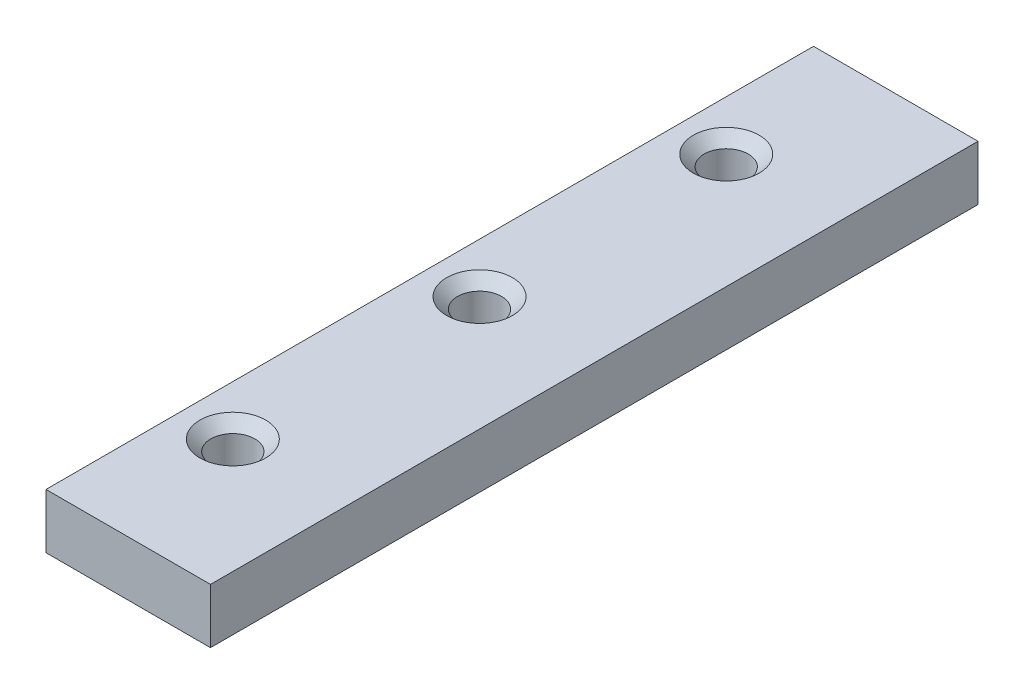
ISO-10303-21;
HEADER;
FILE_DESCRIPTION(('STEP AP214'),'2;1');
FILE_NAME('part.step','',(''),(''),'','','');
FILE_SCHEMA(('AUTOMOTIVE_DESIGN { 1 0 10303 214 1 1 1 1 }'));
ENDSEC;
DATA;
#1=APPLICATION_CONTEXT('core data for automotive mechanical design processes');
#2=APPLICATION_PROTOCOL_DEFINITION('international standard','automotive_design',2000,#1);
#3=PRODUCT_CONTEXT('',#1,'mechanical');
#4=PRODUCT('Part','Part','',(#3));
#5=PRODUCT_RELATED_PRODUCT_CATEGORY('part','',(#4));
#6=PRODUCT_DEFINITION_FORMATION('','',#4);
#7=PRODUCT_DEFINITION_CONTEXT('part definition',#1,'design');
#8=PRODUCT_DEFINITION('design','',#6,#7);
#9=PRODUCT_DEFINITION_SHAPE('','',#8);
#10=(LENGTH_UNIT() NAMED_UNIT(*) SI_UNIT(.MILLI.,.METRE.));
#11=(NAMED_UNIT(*) PLANE_ANGLE_UNIT() SI_UNIT($,.RADIAN.));
#12=(NAMED_UNIT(*) SI_UNIT($,.STERADIAN.) SOLID_ANGLE_UNIT());
#13=UNCERTAINTY_MEASURE_WITH_UNIT(LENGTH_MEASURE(1.E-05),#10,'distance_accuracy_value','');
#14=(GEOMETRIC_REPRESENTATION_CONTEXT(3) GLOBAL_UNCERTAINTY_ASSIGNED_CONTEXT((#13)) GLOBAL_UNIT_ASSIGNED_CONTEXT((#10,
#11,#12)) REPRESENTATION_CONTEXT('',''));
#15=CARTESIAN_POINT('',(0.,0.,0.));
#16=DIRECTION('',(0.,0.,1.));
#17=DIRECTION('',(1.,0.,0.));
#18=AXIS2_PLACEMENT_3D('',#15,#16,#17);
#19=CARTESIAN_POINT('',(0.,6.35,0.));
#20=DIRECTION('',(-1.,0.,0.));
#21=DIRECTION('',(0.,0.,1.));
#22=AXIS2_PLACEMENT_3D('',#19,#20,#21);
#23=PLANE('',#22);
#24=DIRECTION('',(0.,0.,-1.));
#25=VECTOR('',#24,1.);
#26=CARTESIAN_POINT('',(0.,0.,0.));
#27=LINE('',#26,#25);
#28=CARTESIAN_POINT('',(0.,0.,0.));
#29=VERTEX_POINT('',#28);
#30=CARTESIAN_POINT('',(0.,0.,-88.9));
#31=VERTEX_POINT('',#30);
#32=EDGE_CURVE('E102',#29,#31,#27,.T.);
#33=ORIENTED_EDGE('',*,*,#32,.T.);
#34=DIRECTION('',(0.,-1.,0.));
#35=VECTOR('',#34,1.);
#36=CARTESIAN_POINT('',(0.,6.35,-88.9));
#37=LINE('',#36,#35);
#38=CARTESIAN_POINT('',(0.,6.35,-88.9));
#39=VERTEX_POINT('',#38);
#40=EDGE_CURVE('E11',#39,#31,#37,.T.);
#41=ORIENTED_EDGE('',*,*,#40,.F.);
#42=DIRECTION('',(0.,0.,-1.));
#43=VECTOR('',#42,1.);
#44=CARTESIAN_POINT('',(0.,6.35,0.));
#45=LINE('',#44,#43);
#46=CARTESIAN_POINT('',(0.,6.35,0.));
#47=VERTEX_POINT('',#46);
#48=EDGE_CURVE('E90',#47,#39,#45,.T.);
#49=ORIENTED_EDGE('',*,*,#48,.F.);
#50=DIRECTION('',(0.,-1.,0.));
#51=VECTOR('',#50,1.);
#52=CARTESIAN_POINT('',(0.,6.35,0.));
#53=LINE('',#52,#51);
#54=EDGE_CURVE('E98',#47,#29,#53,.T.);
#55=ORIENTED_EDGE('',*,*,#54,.T.);
#56=EDGE_LOOP('',(#33,#41,#49,#55));
#57=FACE_BOUND('',#56,.T.);
#58=ADVANCED_FACE('F39',(#57),#23,.F.);
#59=CARTESIAN_POINT('',(0.,6.35,-88.9));
#60=DIRECTION('',(0.,0.,1.));
#61=DIRECTION('',(1.,0.,0.));
#62=AXIS2_PLACEMENT_3D('',#59,#60,#61);
#63=PLANE('',#62);
#64=DIRECTION('',(-1.,0.,0.));
#65=VECTOR('',#64,1.);
#66=CARTESIAN_POINT('',(0.,0.,-88.9));
#67=LINE('',#66,#65);
#68=CARTESIAN_POINT('',(-19.05,0.,-88.9));
#69=VERTEX_POINT('',#68);
#70=EDGE_CURVE('E94',#31,#69,#67,.T.);
#71=ORIENTED_EDGE('',*,*,#70,.T.);
#72=DIRECTION('',(0.,-1.,0.));
#73=VECTOR('',#72,1.);
#74=CARTESIAN_POINT('',(-19.05,6.35,-88.9));
#75=LINE('',#74,#73);
#76=CARTESIAN_POINT('',(-19.05,6.35,-88.9));
#77=VERTEX_POINT('',#76);
#78=EDGE_CURVE('E47',#77,#69,#75,.T.);
#79=ORIENTED_EDGE('',*,*,#78,.F.);
#80=DIRECTION('',(-1.,0.,0.));
#81=VECTOR('',#80,1.);
#82=CARTESIAN_POINT('',(0.,6.35,-88.9));
#83=LINE('',#82,#81);
#84=EDGE_CURVE('E85',#39,#77,#83,.T.);
#85=ORIENTED_EDGE('',*,*,#84,.F.);
#86=ORIENTED_EDGE('',*,*,#40,.T.);
#87=EDGE_LOOP('',(#71,#79,#85,#86));
#88=FACE_BOUND('',#87,.T.);
#89=ADVANCED_FACE('F93',(#88),#63,.F.);
#90=CARTESIAN_POINT('',(-19.05,6.35,0.));
#91=DIRECTION('',(1.,0.,0.));
#92=DIRECTION('',(0.,0.,-1.));
#93=AXIS2_PLACEMENT_3D('',#90,#91,#92);
#94=PLANE('',#93);
#95=DIRECTION('',(0.,0.,1.));
#96=VECTOR('',#95,1.);
#97=CARTESIAN_POINT('',(-19.05,0.,0.));
#98=LINE('',#97,#96);
#99=CARTESIAN_POINT('',(-19.05,0.,0.));
#100=VERTEX_POINT('',#99);
#101=EDGE_CURVE('E72',#69,#100,#98,.T.);
#102=ORIENTED_EDGE('',*,*,#101,.T.);
#103=DIRECTION('',(0.,-1.,0.));
#104=VECTOR('',#103,1.);
#105=CARTESIAN_POINT('',(-19.05,6.35,0.));
#106=LINE('',#105,#104);
#107=CARTESIAN_POINT('',(-19.05,6.35,0.));
#108=VERTEX_POINT('',#107);
#109=EDGE_CURVE('E95',#108,#100,#106,.T.);
#110=ORIENTED_EDGE('',*,*,#109,.F.);
#111=DIRECTION('',(0.,0.,1.));
#112=VECTOR('',#111,1.);
#113=CARTESIAN_POINT('',(-19.05,6.35,0.));
#114=LINE('',#113,#112);
#115=EDGE_CURVE('E88',#77,#108,#114,.T.);
#116=ORIENTED_EDGE('',*,*,#115,.F.);
#117=ORIENTED_EDGE('',*,*,#78,.T.);
#118=EDGE_LOOP('',(#102,#110,#116,#117));
#119=FACE_BOUND('',#118,.T.);
#120=ADVANCED_FACE('F96',(#119),#94,.F.);
#121=CARTESIAN_POINT('',(0.,6.35,0.));
#122=DIRECTION('',(0.,0.,-1.));
#123=DIRECTION('',(-1.,0.,0.));
#124=AXIS2_PLACEMENT_3D('',#121,#122,#123);
#125=PLANE('',#124);
#126=DIRECTION('',(1.,0.,0.));
#127=VECTOR('',#126,1.);
#128=CARTESIAN_POINT('',(0.,0.,0.));
#129=LINE('',#128,#127);
#130=EDGE_CURVE('E78',#100,#29,#129,.T.);
#131=ORIENTED_EDGE('',*,*,#130,.T.);
#132=ORIENTED_EDGE('',*,*,#54,.F.);
#133=DIRECTION('',(1.,0.,0.));
#134=VECTOR('',#133,1.);
#135=CARTESIAN_POINT('',(0.,6.35,0.));
#136=LINE('',#135,#134);
#137=EDGE_CURVE('E55',#108,#47,#136,.T.);
#138=ORIENTED_EDGE('',*,*,#137,.F.);
#139=ORIENTED_EDGE('',*,*,#109,.T.);
#140=EDGE_LOOP('',(#131,#132,#138,#139));
#141=FACE_BOUND('',#140,.T.);
#142=ADVANCED_FACE('F110',(#141),#125,.F.);
#143=CARTESIAN_POINT('',(0.,6.35,0.));
#144=DIRECTION('',(0.,1.,0.));
#145=DIRECTION('',(0.,0.,1.));
#146=AXIS2_PLACEMENT_3D('',#143,#144,#145);
#147=PLANE('',#146);
#148=CARTESIAN_POINT('',(-13.2844190722783,6.35,-15.875));
#149=DIRECTION('',(0.,1.,0.));
#150=DIRECTION('',(0.,0.,1.));
#151=AXIS2_PLACEMENT_3D('',#148,#149,#150);
#152=CIRCLE('',#151,3.81);
#153=CARTESIAN_POINT('',(-13.2844190722783,6.35,-12.065));
#154=VERTEX_POINT('',#153);
#155=EDGE_CURVE('E139',#154,#154,#152,.T.);
#156=ORIENTED_EDGE('',*,*,#155,.F.);
#157=EDGE_LOOP('',(#156));
#158=FACE_BOUND('',#157,.T.);
#159=CARTESIAN_POINT('',(-13.2844190722783,6.35,-44.45));
#160=DIRECTION('',(0.,1.,0.));
#161=DIRECTION('',(0.,0.,1.));
#162=AXIS2_PLACEMENT_3D('',#159,#160,#161);
#163=CIRCLE('',#162,3.81);
#164=CARTESIAN_POINT('',(-13.2844190722783,6.35,-40.64));
#165=VERTEX_POINT('',#164);
#166=EDGE_CURVE('E130',#165,#165,#163,.T.);
#167=ORIENTED_EDGE('',*,*,#166,.F.);
#168=EDGE_LOOP('',(#167));
#169=FACE_BOUND('',#168,.T.);
#170=CARTESIAN_POINT('',(-13.2844190722783,6.35,-73.025));
#171=DIRECTION('',(0.,1.,0.));
#172=DIRECTION('',(0.,0.,1.));
#173=AXIS2_PLACEMENT_3D('',#170,#171,#172);
#174=CIRCLE('',#173,3.81);
#175=CARTESIAN_POINT('',(-13.2844190722783,6.35,-69.215));
#176=VERTEX_POINT('',#175);
#177=EDGE_CURVE('E121',#176,#176,#174,.T.);
#178=ORIENTED_EDGE('',*,*,#177,.F.);
#179=EDGE_LOOP('',(#178));
#180=FACE_BOUND('',#179,.T.);
#181=ORIENTED_EDGE('',*,*,#48,.T.);
#182=ORIENTED_EDGE('',*,*,#84,.T.);
#183=ORIENTED_EDGE('',*,*,#115,.T.);
#184=ORIENTED_EDGE('',*,*,#137,.T.);
#185=EDGE_LOOP('',(#181,#182,#183,#184));
#186=FACE_BOUND('',#185,.T.);
#187=ADVANCED_FACE('F86',(#158,#169,#180,#186),#147,.T.);
#188=CARTESIAN_POINT('',(0.,0.,0.));
#189=DIRECTION('',(0.,1.,0.));
#190=DIRECTION('',(0.,0.,1.));
#191=AXIS2_PLACEMENT_3D('',#188,#189,#190);
#192=PLANE('',#191);
#193=CARTESIAN_POINT('',(-13.2844190722783,0.,-15.875));
#194=DIRECTION('',(0.,1.,0.));
#195=DIRECTION('',(0.,0.,1.));
#196=AXIS2_PLACEMENT_3D('',#193,#194,#195);
#197=CIRCLE('',#196,2.5527);
#198=CARTESIAN_POINT('',(-13.2844190722783,0.,-13.3223));
#199=VERTEX_POINT('',#198);
#200=EDGE_CURVE('E133',#199,#199,#197,.T.);
#201=ORIENTED_EDGE('',*,*,#200,.T.);
#202=EDGE_LOOP('',(#201));
#203=FACE_BOUND('',#202,.T.);
#204=CARTESIAN_POINT('',(-13.2844190722783,0.,-44.45));
#205=DIRECTION('',(0.,1.,0.));
#206=DIRECTION('',(0.,0.,1.));
#207=AXIS2_PLACEMENT_3D('',#204,#205,#206);
#208=CIRCLE('',#207,2.5527);
#209=CARTESIAN_POINT('',(-13.2844190722783,0.,-41.8973));
#210=VERTEX_POINT('',#209);
#211=EDGE_CURVE('E124',#210,#210,#208,.T.);
#212=ORIENTED_EDGE('',*,*,#211,.T.);
#213=EDGE_LOOP('',(#212));
#214=FACE_BOUND('',#213,.T.);
#215=CARTESIAN_POINT('',(-13.2844190722783,0.,-73.025));
#216=DIRECTION('',(0.,1.,0.));
#217=DIRECTION('',(0.,0.,1.));
#218=AXIS2_PLACEMENT_3D('',#215,#216,#217);
#219=CIRCLE('',#218,2.5527);
#220=CARTESIAN_POINT('',(-13.2844190722783,0.,-70.4723));
#221=VERTEX_POINT('',#220);
#222=EDGE_CURVE('E105',#221,#221,#219,.T.);
#223=ORIENTED_EDGE('',*,*,#222,.T.);
#224=EDGE_LOOP('',(#223));
#225=FACE_BOUND('',#224,.T.);
#226=ORIENTED_EDGE('',*,*,#32,.F.);
#227=ORIENTED_EDGE('',*,*,#130,.F.);
#228=ORIENTED_EDGE('',*,*,#101,.F.);
#229=ORIENTED_EDGE('',*,*,#70,.F.);
#230=EDGE_LOOP('',(#226,#227,#228,#229));
#231=FACE_BOUND('',#230,.T.);
#232=ADVANCED_FACE('F113',(#203,#214,#225,#231),#192,.F.);
#233=CARTESIAN_POINT('',(-13.2844190722783,6.35,-73.025));
#234=DIRECTION('',(0.,1.,0.));
#235=DIRECTION('',(0.,0.,1.));
#236=AXIS2_PLACEMENT_3D('',#233,#234,#235);
#237=CYLINDRICAL_SURFACE('',#236,2.55269999999999);
#238=ORIENTED_EDGE('',*,*,#222,.F.);
#239=EDGE_LOOP('',(#238));
#240=FACE_BOUND('',#239,.T.);
#241=CARTESIAN_POINT('',(-13.2844190722783,5.0927,-73.025));
#242=DIRECTION('',(0.,1.,0.));
#243=DIRECTION('',(0.,0.,1.));
#244=AXIS2_PLACEMENT_3D('',#241,#242,#243);
#245=CIRCLE('',#244,2.55269999999999);
#246=CARTESIAN_POINT('',(-13.2844190722783,5.0927,-70.4723));
#247=VERTEX_POINT('',#246);
#248=EDGE_CURVE('E118',#247,#247,#245,.T.);
#249=ORIENTED_EDGE('',*,*,#248,.T.);
#250=EDGE_LOOP('',(#249));
#251=FACE_BOUND('',#250,.T.);
#252=ADVANCED_FACE('F155',(#240,#251),#237,.F.);
#253=CARTESIAN_POINT('',(-13.2844190722783,6.35,-73.025));
#254=DIRECTION('',(0.,1.,0.));
#255=DIRECTION('',(0.,0.,1.));
#256=AXIS2_PLACEMENT_3D('',#253,#254,#255);
#257=CONICAL_SURFACE('',#256,3.81,0.785398163397451);
#258=ORIENTED_EDGE('',*,*,#248,.F.);
#259=EDGE_LOOP('',(#258));
#260=FACE_BOUND('',#259,.T.);
#261=ORIENTED_EDGE('',*,*,#177,.T.);
#262=EDGE_LOOP('',(#261));
#263=FACE_BOUND('',#262,.T.);
#264=ADVANCED_FACE('F152',(#260,#263),#257,.F.);
#265=CARTESIAN_POINT('',(-13.2844190722783,6.35,-44.45));
#266=DIRECTION('',(0.,1.,0.));
#267=DIRECTION('',(0.,0.,1.));
#268=AXIS2_PLACEMENT_3D('',#265,#266,#267);
#269=CYLINDRICAL_SURFACE('',#268,2.55269999999999);
#270=ORIENTED_EDGE('',*,*,#211,.F.);
#271=EDGE_LOOP('',(#270));
#272=FACE_BOUND('',#271,.T.);
#273=CARTESIAN_POINT('',(-13.2844190722783,5.0927,-44.45));
#274=DIRECTION('',(0.,1.,0.));
#275=DIRECTION('',(0.,0.,1.));
#276=AXIS2_PLACEMENT_3D('',#273,#274,#275);
#277=CIRCLE('',#276,2.55269999999999);
#278=CARTESIAN_POINT('',(-13.2844190722783,5.0927,-41.8973));
#279=VERTEX_POINT('',#278);
#280=EDGE_CURVE('E127',#279,#279,#277,.T.);
#281=ORIENTED_EDGE('',*,*,#280,.T.);
#282=EDGE_LOOP('',(#281));
#283=FACE_BOUND('',#282,.T.);
#284=ADVANCED_FACE('F154',(#272,#283),#269,.F.);
#285=CARTESIAN_POINT('',(-13.2844190722783,6.35,-44.45));
#286=DIRECTION('',(0.,1.,0.));
#287=DIRECTION('',(0.,0.,1.));
#288=AXIS2_PLACEMENT_3D('',#285,#286,#287);
#289=CONICAL_SURFACE('',#288,3.81,0.785398163397451);
#290=ORIENTED_EDGE('',*,*,#280,.F.);
#291=EDGE_LOOP('',(#290));
#292=FACE_BOUND('',#291,.T.);
#293=ORIENTED_EDGE('',*,*,#166,.T.);
#294=EDGE_LOOP('',(#293));
#295=FACE_BOUND('',#294,.T.);
#296=ADVANCED_FACE('F162',(#292,#295),#289,.F.);
#297=CARTESIAN_POINT('',(-13.2844190722783,6.35,-15.875));
#298=DIRECTION('',(0.,1.,0.));
#299=DIRECTION('',(0.,0.,1.));
#300=AXIS2_PLACEMENT_3D('',#297,#298,#299);
#301=CYLINDRICAL_SURFACE('',#300,2.55269999999999);
#302=ORIENTED_EDGE('',*,*,#200,.F.);
#303=EDGE_LOOP('',(#302));
#304=FACE_BOUND('',#303,.T.);
#305=CARTESIAN_POINT('',(-13.2844190722783,5.0927,-15.875));
#306=DIRECTION('',(0.,1.,0.));
#307=DIRECTION('',(0.,0.,1.));
#308=AXIS2_PLACEMENT_3D('',#305,#306,#307);
#309=CIRCLE('',#308,2.55269999999999);
#310=CARTESIAN_POINT('',(-13.2844190722783,5.0927,-13.3223));
#311=VERTEX_POINT('',#310);
#312=EDGE_CURVE('E136',#311,#311,#309,.T.);
#313=ORIENTED_EDGE('',*,*,#312,.T.);
#314=EDGE_LOOP('',(#313));
#315=FACE_BOUND('',#314,.T.);
#316=ADVANCED_FACE('F194',(#304,#315),#301,.F.);
#317=CARTESIAN_POINT('',(-13.2844190722783,6.35,-15.875));
#318=DIRECTION('',(0.,1.,0.));
#319=DIRECTION('',(0.,0.,1.));
#320=AXIS2_PLACEMENT_3D('',#317,#318,#319);
#321=CONICAL_SURFACE('',#320,3.81,0.785398163397451);
#322=ORIENTED_EDGE('',*,*,#312,.F.);
#323=EDGE_LOOP('',(#322));
#324=FACE_BOUND('',#323,.T.);
#325=ORIENTED_EDGE('',*,*,#155,.T.);
#326=EDGE_LOOP('',(#325));
#327=FACE_BOUND('',#326,.T.);
#328=ADVANCED_FACE('F143',(#324,#327),#321,.F.);
#329=CLOSED_SHELL('',(#58,#89,#120,#142,#187,#232,#252,#264,#284,#296,#316,#328));
#330=MANIFOLD_SOLID_BREP('B2',#329);
#331=ADVANCED_BREP_SHAPE_REPRESENTATION('',(#18,#330),#14);
#332=SHAPE_DEFINITION_REPRESENTATION(#9,#331);
ENDSEC;
END-ISO-10303-21;
